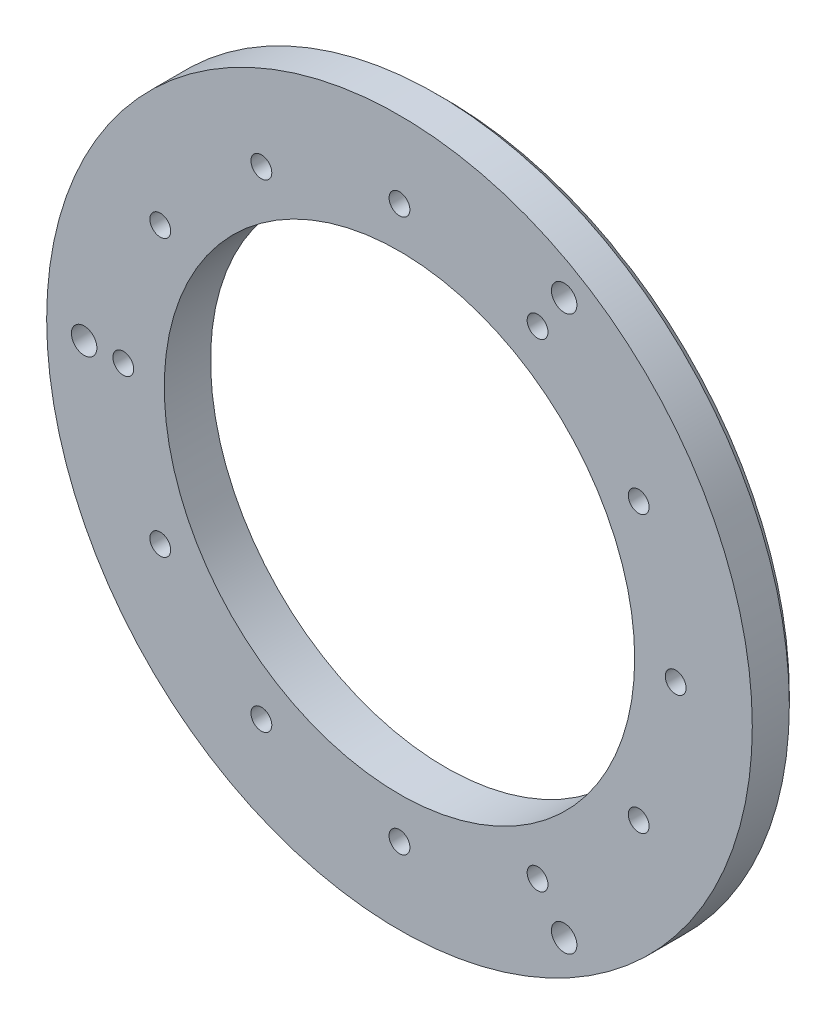
ISO-10303-21;
HEADER;
FILE_DESCRIPTION(('STEP AP214'),'2;1');
FILE_NAME('part.step','',(''),(''),'','','');
FILE_SCHEMA(('AUTOMOTIVE_DESIGN { 1 0 10303 214 1 1 1 1 }'));
ENDSEC;
DATA;
#1=APPLICATION_CONTEXT('core data for automotive mechanical design processes');
#2=APPLICATION_PROTOCOL_DEFINITION('international standard','automotive_design',2000,#1);
#3=PRODUCT_CONTEXT('',#1,'mechanical');
#4=PRODUCT('Part','Part','',(#3));
#5=PRODUCT_RELATED_PRODUCT_CATEGORY('part','',(#4));
#6=PRODUCT_DEFINITION_FORMATION('','',#4);
#7=PRODUCT_DEFINITION_CONTEXT('part definition',#1,'design');
#8=PRODUCT_DEFINITION('design','',#6,#7);
#9=PRODUCT_DEFINITION_SHAPE('','',#8);
#10=(LENGTH_UNIT() NAMED_UNIT(*) SI_UNIT(.MILLI.,.METRE.));
#11=(NAMED_UNIT(*) PLANE_ANGLE_UNIT() SI_UNIT($,.RADIAN.));
#12=(NAMED_UNIT(*) SI_UNIT($,.STERADIAN.) SOLID_ANGLE_UNIT());
#13=UNCERTAINTY_MEASURE_WITH_UNIT(LENGTH_MEASURE(1.E-05),#10,'distance_accuracy_value','');
#14=(GEOMETRIC_REPRESENTATION_CONTEXT(3) GLOBAL_UNCERTAINTY_ASSIGNED_CONTEXT((#13)) GLOBAL_UNIT_ASSIGNED_CONTEXT((#10,
#11,#12)) REPRESENTATION_CONTEXT('',''));
#15=CARTESIAN_POINT('',(0.,0.,0.));
#16=DIRECTION('',(0.,0.,1.));
#17=DIRECTION('',(1.,0.,0.));
#18=AXIS2_PLACEMENT_3D('',#15,#16,#17);
#19=CARTESIAN_POINT('',(0.,0.,0.));
#20=DIRECTION('',(0.,0.,1.));
#21=DIRECTION('',(1.,0.,0.));
#22=AXIS2_PLACEMENT_3D('',#19,#20,#21);
#23=PLANE('',#22);
#24=CARTESIAN_POINT('',(-68.1,0.,0.));
#25=DIRECTION('',(0.,0.,-1.));
#26=DIRECTION('',(-1.,0.,0.));
#27=AXIS2_PLACEMENT_3D('',#24,#25,#26);
#28=CIRCLE('',#27,5.2);
#29=CARTESIAN_POINT('',(-73.3,0.,0.));
#30=VERTEX_POINT('',#29);
#31=EDGE_CURVE('E261',#30,#30,#28,.T.);
#32=ORIENTED_EDGE('',*,*,#31,.F.);
#33=EDGE_LOOP('',(#32));
#34=FACE_BOUND('',#33,.T.);
#35=CARTESIAN_POINT('',(0.,0.,0.));
#36=DIRECTION('',(0.,0.,1.));
#37=DIRECTION('',(1.,0.,0.));
#38=AXIS2_PLACEMENT_3D('',#35,#36,#37);
#39=CIRCLE('',#38,50.8);
#40=CARTESIAN_POINT('',(50.8,0.,0.));
#41=VERTEX_POINT('',#40);
#42=EDGE_CURVE('E166',#41,#41,#39,.T.);
#43=ORIENTED_EDGE('',*,*,#42,.T.);
#44=EDGE_LOOP('',(#43));
#45=FACE_BOUND('',#44,.T.);
#46=CARTESIAN_POINT('',(29.8250000000003,51.6584153357416,0.));
#47=DIRECTION('',(0.,0.,-1.));
#48=DIRECTION('',(-1.,0.,0.));
#49=AXIS2_PLACEMENT_3D('',#46,#47,#48);
#50=CIRCLE('',#49,2.2479);
#51=CARTESIAN_POINT('',(27.5771000000003,51.6584153357416,0.));
#52=VERTEX_POINT('',#51);
#53=EDGE_CURVE('E174',#52,#52,#50,.T.);
#54=ORIENTED_EDGE('',*,*,#53,.F.);
#55=EDGE_LOOP('',(#54));
#56=FACE_BOUND('',#55,.T.);
#57=CARTESIAN_POINT('',(51.658415335742,29.8249999999996,0.));
#58=DIRECTION('',(0.,0.,-1.));
#59=DIRECTION('',(-1.,0.,0.));
#60=AXIS2_PLACEMENT_3D('',#57,#58,#59);
#61=CIRCLE('',#60,2.2479);
#62=CARTESIAN_POINT('',(49.410515335742,29.8249999999996,0.));
#63=VERTEX_POINT('',#62);
#64=EDGE_CURVE('E180',#63,#63,#61,.T.);
#65=ORIENTED_EDGE('',*,*,#64,.F.);
#66=EDGE_LOOP('',(#65));
#67=FACE_BOUND('',#66,.T.);
#68=CARTESIAN_POINT('',(59.65,-4.16333634234434E-13,0.));
#69=DIRECTION('',(0.,0.,-1.));
#70=DIRECTION('',(-1.,0.,0.));
#71=AXIS2_PLACEMENT_3D('',#68,#69,#70);
#72=CIRCLE('',#71,2.2479);
#73=CARTESIAN_POINT('',(57.4021,-4.16333634234434E-13,0.));
#74=VERTEX_POINT('',#73);
#75=EDGE_CURVE('E186',#74,#74,#72,.T.);
#76=ORIENTED_EDGE('',*,*,#75,.F.);
#77=EDGE_LOOP('',(#76));
#78=FACE_BOUND('',#77,.T.);
#79=CARTESIAN_POINT('',(51.6584153357416,-29.8250000000004,0.));
#80=DIRECTION('',(0.,0.,-1.));
#81=DIRECTION('',(-1.,0.,0.));
#82=AXIS2_PLACEMENT_3D('',#79,#80,#81);
#83=CIRCLE('',#82,2.2479);
#84=CARTESIAN_POINT('',(49.4105153357416,-29.8250000000004,0.));
#85=VERTEX_POINT('',#84);
#86=EDGE_CURVE('E192',#85,#85,#83,.T.);
#87=ORIENTED_EDGE('',*,*,#86,.F.);
#88=EDGE_LOOP('',(#87));
#89=FACE_BOUND('',#88,.T.);
#90=CARTESIAN_POINT('',(29.8249999999997,-51.658415335742,0.));
#91=DIRECTION('',(0.,0.,-1.));
#92=DIRECTION('',(-1.,0.,0.));
#93=AXIS2_PLACEMENT_3D('',#90,#91,#92);
#94=CIRCLE('',#93,2.2479);
#95=CARTESIAN_POINT('',(27.5770999999997,-51.658415335742,0.));
#96=VERTEX_POINT('',#95);
#97=EDGE_CURVE('E198',#96,#96,#94,.T.);
#98=ORIENTED_EDGE('',*,*,#97,.F.);
#99=EDGE_LOOP('',(#98));
#100=FACE_BOUND('',#99,.T.);
#101=CARTESIAN_POINT('',(-3.7470027081099E-13,-59.6500000000001,0.));
#102=DIRECTION('',(0.,0.,-1.));
#103=DIRECTION('',(-1.,0.,0.));
#104=AXIS2_PLACEMENT_3D('',#101,#102,#103);
#105=CIRCLE('',#104,2.2479);
#106=CARTESIAN_POINT('',(-2.24790000000037,-59.6500000000001,0.));
#107=VERTEX_POINT('',#106);
#108=EDGE_CURVE('E204',#107,#107,#105,.T.);
#109=ORIENTED_EDGE('',*,*,#108,.F.);
#110=EDGE_LOOP('',(#109));
#111=FACE_BOUND('',#110,.T.);
#112=CARTESIAN_POINT('',(-29.8250000000004,-51.6584153357416,0.));
#113=DIRECTION('',(0.,0.,-1.));
#114=DIRECTION('',(-1.,0.,0.));
#115=AXIS2_PLACEMENT_3D('',#112,#113,#114);
#116=CIRCLE('',#115,2.2479);
#117=CARTESIAN_POINT('',(-32.0729000000003,-51.6584153357416,0.));
#118=VERTEX_POINT('',#117);
#119=EDGE_CURVE('E210',#118,#118,#116,.T.);
#120=ORIENTED_EDGE('',*,*,#119,.F.);
#121=EDGE_LOOP('',(#120));
#122=FACE_BOUND('',#121,.T.);
#123=CARTESIAN_POINT('',(-51.658415335742,-29.8249999999997,0.));
#124=DIRECTION('',(0.,0.,-1.));
#125=DIRECTION('',(-1.,0.,0.));
#126=AXIS2_PLACEMENT_3D('',#123,#124,#125);
#127=CIRCLE('',#126,2.2479);
#128=CARTESIAN_POINT('',(-53.906315335742,-29.8249999999997,0.));
#129=VERTEX_POINT('',#128);
#130=EDGE_CURVE('E216',#129,#129,#127,.T.);
#131=ORIENTED_EDGE('',*,*,#130,.F.);
#132=EDGE_LOOP('',(#131));
#133=FACE_BOUND('',#132,.T.);
#134=CARTESIAN_POINT('',(-59.65,3.33066907387547E-13,0.));
#135=DIRECTION('',(0.,0.,-1.));
#136=DIRECTION('',(-1.,0.,0.));
#137=AXIS2_PLACEMENT_3D('',#134,#135,#136);
#138=CIRCLE('',#137,2.2479);
#139=CARTESIAN_POINT('',(-61.8979,3.33066907387547E-13,0.));
#140=VERTEX_POINT('',#139);
#141=EDGE_CURVE('E222',#140,#140,#138,.T.);
#142=ORIENTED_EDGE('',*,*,#141,.F.);
#143=EDGE_LOOP('',(#142));
#144=FACE_BOUND('',#143,.T.);
#145=CARTESIAN_POINT('',(-29.8249999999997,51.6584153357419,0.));
#146=DIRECTION('',(0.,0.,-1.));
#147=DIRECTION('',(-1.,0.,0.));
#148=AXIS2_PLACEMENT_3D('',#145,#146,#147);
#149=CIRCLE('',#148,2.2479);
#150=CARTESIAN_POINT('',(-32.0728999999997,51.6584153357419,0.));
#151=VERTEX_POINT('',#150);
#152=EDGE_CURVE('E228',#151,#151,#149,.T.);
#153=ORIENTED_EDGE('',*,*,#152,.F.);
#154=EDGE_LOOP('',(#153));
#155=FACE_BOUND('',#154,.T.);
#156=CARTESIAN_POINT('',(-51.6584153357416,29.8250000000003,0.));
#157=DIRECTION('',(0.,0.,-1.));
#158=DIRECTION('',(-1.,0.,0.));
#159=AXIS2_PLACEMENT_3D('',#156,#157,#158);
#160=CIRCLE('',#159,2.2479);
#161=CARTESIAN_POINT('',(-53.9063153357416,29.8250000000003,0.));
#162=VERTEX_POINT('',#161);
#163=EDGE_CURVE('E234',#162,#162,#160,.T.);
#164=ORIENTED_EDGE('',*,*,#163,.F.);
#165=EDGE_LOOP('',(#164));
#166=FACE_BOUND('',#165,.T.);
#167=CARTESIAN_POINT('',(3.6949610038306E-13,59.65,0.));
#168=DIRECTION('',(0.,0.,-1.));
#169=DIRECTION('',(-1.,0.,0.));
#170=AXIS2_PLACEMENT_3D('',#167,#168,#169);
#171=CIRCLE('',#170,2.2479);
#172=CARTESIAN_POINT('',(-2.24789999999963,59.65,0.));
#173=VERTEX_POINT('',#172);
#174=EDGE_CURVE('E240',#173,#173,#171,.T.);
#175=ORIENTED_EDGE('',*,*,#174,.F.);
#176=EDGE_LOOP('',(#175));
#177=FACE_BOUND('',#176,.T.);
#178=CARTESIAN_POINT('',(0.,0.,0.));
#179=DIRECTION('',(0.,0.,1.));
#180=DIRECTION('',(1.,0.,0.));
#181=AXIS2_PLACEMENT_3D('',#178,#179,#180);
#182=CIRCLE('',#181,74.2);
#183=CARTESIAN_POINT('',(40.0680427160487,62.4515168182879,0.));
#184=VERTEX_POINT('',#183);
#185=CARTESIAN_POINT('',(40.0680427160498,-62.4515168182872,0.));
#186=VERTEX_POINT('',#185);
#187=EDGE_CURVE('E69',#184,#186,#182,.F.);
#188=ORIENTED_EDGE('',*,*,#187,.T.);
#189=CARTESIAN_POINT('',(35.5650000000003,-59.8510156555431,0.));
#190=DIRECTION('',(0.,0.,-1.));
#191=DIRECTION('',(-1.,0.,0.));
#192=AXIS2_PLACEMENT_3D('',#189,#190,#191);
#193=CIRCLE('',#192,5.2);
#194=CARTESIAN_POINT('',(35.6962298958078,-65.0493594989654,0.));
#195=VERTEX_POINT('',#194);
#196=EDGE_CURVE('E51',#195,#186,#193,.T.);
#197=ORIENTED_EDGE('',*,*,#196,.F.);
#198=CARTESIAN_POINT('',(35.69622989581,65.0493594989642,0.));
#199=VERTEX_POINT('',#198);
#200=EDGE_CURVE('E58',#195,#199,#182,.F.);
#201=ORIENTED_EDGE('',*,*,#200,.T.);
#202=CARTESIAN_POINT('',(35.5650000000002,59.851015655542,0.));
#203=DIRECTION('',(0.,0.,-1.));
#204=DIRECTION('',(-1.,0.,0.));
#205=AXIS2_PLACEMENT_3D('',#202,#203,#204);
#206=CIRCLE('',#205,5.2);
#207=EDGE_CURVE('E249',#184,#199,#206,.T.);
#208=ORIENTED_EDGE('',*,*,#207,.F.);
#209=EDGE_LOOP('',(#188,#197,#201,#208));
#210=FACE_BOUND('',#209,.T.);
#211=ADVANCED_FACE('F33',(#34,#45,#56,#67,#78,#89,#100,#111,#122,#133,#144,#155,#166,#177,#210),
#23,.F.);
#212=CARTESIAN_POINT('',(0.,0.,10.));
#213=DIRECTION('',(0.,0.,1.));
#214=DIRECTION('',(1.,0.,0.));
#215=AXIS2_PLACEMENT_3D('',#212,#213,#214);
#216=PLANE('',#215);
#217=CARTESIAN_POINT('',(-68.1,0.,10.));
#218=DIRECTION('',(0.,0.,-1.));
#219=DIRECTION('',(-1.,0.,0.));
#220=AXIS2_PLACEMENT_3D('',#217,#218,#219);
#221=CIRCLE('',#220,2.74999999999999);
#222=CARTESIAN_POINT('',(-70.85,0.,10.));
#223=VERTEX_POINT('',#222);
#224=EDGE_CURVE('E71',#223,#223,#221,.T.);
#225=ORIENTED_EDGE('',*,*,#224,.T.);
#226=EDGE_LOOP('',(#225));
#227=FACE_BOUND('',#226,.T.);
#228=CARTESIAN_POINT('',(35.5650000000003,-59.8510156555431,10.));
#229=DIRECTION('',(0.,0.,-1.));
#230=DIRECTION('',(-1.,0.,0.));
#231=AXIS2_PLACEMENT_3D('',#228,#229,#230);
#232=CIRCLE('',#231,2.75);
#233=CARTESIAN_POINT('',(32.8150000000003,-59.8510156555431,10.));
#234=VERTEX_POINT('',#233);
#235=EDGE_CURVE('E251',#234,#234,#232,.T.);
#236=ORIENTED_EDGE('',*,*,#235,.T.);
#237=EDGE_LOOP('',(#236));
#238=FACE_BOUND('',#237,.T.);
#239=CARTESIAN_POINT('',(35.5650000000002,59.851015655542,10.));
#240=DIRECTION('',(0.,0.,-1.));
#241=DIRECTION('',(-1.,0.,0.));
#242=AXIS2_PLACEMENT_3D('',#239,#240,#241);
#243=CIRCLE('',#242,2.75);
#244=CARTESIAN_POINT('',(32.8150000000003,59.851015655542,10.));
#245=VERTEX_POINT('',#244);
#246=EDGE_CURVE('E243',#245,#245,#243,.T.);
#247=ORIENTED_EDGE('',*,*,#246,.T.);
#248=EDGE_LOOP('',(#247));
#249=FACE_BOUND('',#248,.T.);
#250=CARTESIAN_POINT('',(3.6949610038306E-13,59.65,10.));
#251=DIRECTION('',(0.,0.,-1.));
#252=DIRECTION('',(-1.,0.,0.));
#253=AXIS2_PLACEMENT_3D('',#250,#251,#252);
#254=CIRCLE('',#253,2.2479);
#255=CARTESIAN_POINT('',(-2.24789999999963,59.65,10.));
#256=VERTEX_POINT('',#255);
#257=EDGE_CURVE('E237',#256,#256,#254,.T.);
#258=ORIENTED_EDGE('',*,*,#257,.T.);
#259=EDGE_LOOP('',(#258));
#260=FACE_BOUND('',#259,.T.);
#261=CARTESIAN_POINT('',(-51.6584153357416,29.8250000000003,10.));
#262=DIRECTION('',(0.,0.,-1.));
#263=DIRECTION('',(-1.,0.,0.));
#264=AXIS2_PLACEMENT_3D('',#261,#262,#263);
#265=CIRCLE('',#264,2.2479);
#266=CARTESIAN_POINT('',(-53.9063153357416,29.8250000000003,10.));
#267=VERTEX_POINT('',#266);
#268=EDGE_CURVE('E231',#267,#267,#265,.T.);
#269=ORIENTED_EDGE('',*,*,#268,.T.);
#270=EDGE_LOOP('',(#269));
#271=FACE_BOUND('',#270,.T.);
#272=CARTESIAN_POINT('',(-29.8249999999997,51.6584153357419,10.));
#273=DIRECTION('',(0.,0.,-1.));
#274=DIRECTION('',(-1.,0.,0.));
#275=AXIS2_PLACEMENT_3D('',#272,#273,#274);
#276=CIRCLE('',#275,2.2479);
#277=CARTESIAN_POINT('',(-32.0728999999997,51.6584153357419,10.));
#278=VERTEX_POINT('',#277);
#279=EDGE_CURVE('E225',#278,#278,#276,.T.);
#280=ORIENTED_EDGE('',*,*,#279,.T.);
#281=EDGE_LOOP('',(#280));
#282=FACE_BOUND('',#281,.T.);
#283=CARTESIAN_POINT('',(-59.65,3.33066907387547E-13,10.));
#284=DIRECTION('',(0.,0.,-1.));
#285=DIRECTION('',(-1.,0.,0.));
#286=AXIS2_PLACEMENT_3D('',#283,#284,#285);
#287=CIRCLE('',#286,2.2479);
#288=CARTESIAN_POINT('',(-61.8979,3.33066907387547E-13,10.));
#289=VERTEX_POINT('',#288);
#290=EDGE_CURVE('E219',#289,#289,#287,.T.);
#291=ORIENTED_EDGE('',*,*,#290,.T.);
#292=EDGE_LOOP('',(#291));
#293=FACE_BOUND('',#292,.T.);
#294=CARTESIAN_POINT('',(-51.658415335742,-29.8249999999997,10.));
#295=DIRECTION('',(0.,0.,-1.));
#296=DIRECTION('',(-1.,0.,0.));
#297=AXIS2_PLACEMENT_3D('',#294,#295,#296);
#298=CIRCLE('',#297,2.2479);
#299=CARTESIAN_POINT('',(-53.906315335742,-29.8249999999997,10.));
#300=VERTEX_POINT('',#299);
#301=EDGE_CURVE('E213',#300,#300,#298,.T.);
#302=ORIENTED_EDGE('',*,*,#301,.T.);
#303=EDGE_LOOP('',(#302));
#304=FACE_BOUND('',#303,.T.);
#305=CARTESIAN_POINT('',(-29.8250000000004,-51.6584153357416,10.));
#306=DIRECTION('',(0.,0.,-1.));
#307=DIRECTION('',(-1.,0.,0.));
#308=AXIS2_PLACEMENT_3D('',#305,#306,#307);
#309=CIRCLE('',#308,2.2479);
#310=CARTESIAN_POINT('',(-32.0729000000003,-51.6584153357416,10.));
#311=VERTEX_POINT('',#310);
#312=EDGE_CURVE('E207',#311,#311,#309,.T.);
#313=ORIENTED_EDGE('',*,*,#312,.T.);
#314=EDGE_LOOP('',(#313));
#315=FACE_BOUND('',#314,.T.);
#316=CARTESIAN_POINT('',(-3.7470027081099E-13,-59.6500000000001,10.));
#317=DIRECTION('',(0.,0.,-1.));
#318=DIRECTION('',(-1.,0.,0.));
#319=AXIS2_PLACEMENT_3D('',#316,#317,#318);
#320=CIRCLE('',#319,2.2479);
#321=CARTESIAN_POINT('',(-2.24790000000037,-59.6500000000001,10.));
#322=VERTEX_POINT('',#321);
#323=EDGE_CURVE('E201',#322,#322,#320,.T.);
#324=ORIENTED_EDGE('',*,*,#323,.T.);
#325=EDGE_LOOP('',(#324));
#326=FACE_BOUND('',#325,.T.);
#327=CARTESIAN_POINT('',(29.8249999999997,-51.658415335742,10.));
#328=DIRECTION('',(0.,0.,-1.));
#329=DIRECTION('',(-1.,0.,0.));
#330=AXIS2_PLACEMENT_3D('',#327,#328,#329);
#331=CIRCLE('',#330,2.2479);
#332=CARTESIAN_POINT('',(27.5770999999997,-51.658415335742,10.));
#333=VERTEX_POINT('',#332);
#334=EDGE_CURVE('E195',#333,#333,#331,.T.);
#335=ORIENTED_EDGE('',*,*,#334,.T.);
#336=EDGE_LOOP('',(#335));
#337=FACE_BOUND('',#336,.T.);
#338=CARTESIAN_POINT('',(51.6584153357416,-29.8250000000004,10.));
#339=DIRECTION('',(0.,0.,-1.));
#340=DIRECTION('',(-1.,0.,0.));
#341=AXIS2_PLACEMENT_3D('',#338,#339,#340);
#342=CIRCLE('',#341,2.2479);
#343=CARTESIAN_POINT('',(49.4105153357416,-29.8250000000004,10.));
#344=VERTEX_POINT('',#343);
#345=EDGE_CURVE('E189',#344,#344,#342,.T.);
#346=ORIENTED_EDGE('',*,*,#345,.T.);
#347=EDGE_LOOP('',(#346));
#348=FACE_BOUND('',#347,.T.);
#349=CARTESIAN_POINT('',(59.65,-4.16333634234434E-13,10.));
#350=DIRECTION('',(0.,0.,-1.));
#351=DIRECTION('',(-1.,0.,0.));
#352=AXIS2_PLACEMENT_3D('',#349,#350,#351);
#353=CIRCLE('',#352,2.2479);
#354=CARTESIAN_POINT('',(57.4021,-4.16333634234434E-13,10.));
#355=VERTEX_POINT('',#354);
#356=EDGE_CURVE('E183',#355,#355,#353,.T.);
#357=ORIENTED_EDGE('',*,*,#356,.T.);
#358=EDGE_LOOP('',(#357));
#359=FACE_BOUND('',#358,.T.);
#360=CARTESIAN_POINT('',(51.658415335742,29.8249999999996,10.));
#361=DIRECTION('',(0.,0.,-1.));
#362=DIRECTION('',(-1.,0.,0.));
#363=AXIS2_PLACEMENT_3D('',#360,#361,#362);
#364=CIRCLE('',#363,2.2479);
#365=CARTESIAN_POINT('',(49.410515335742,29.8249999999996,10.));
#366=VERTEX_POINT('',#365);
#367=EDGE_CURVE('E177',#366,#366,#364,.T.);
#368=ORIENTED_EDGE('',*,*,#367,.T.);
#369=EDGE_LOOP('',(#368));
#370=FACE_BOUND('',#369,.T.);
#371=CARTESIAN_POINT('',(29.8250000000003,51.6584153357416,10.));
#372=DIRECTION('',(0.,0.,-1.));
#373=DIRECTION('',(-1.,0.,0.));
#374=AXIS2_PLACEMENT_3D('',#371,#372,#373);
#375=CIRCLE('',#374,2.2479);
#376=CARTESIAN_POINT('',(27.5771000000003,51.6584153357416,10.));
#377=VERTEX_POINT('',#376);
#378=EDGE_CURVE('E170',#377,#377,#375,.T.);
#379=ORIENTED_EDGE('',*,*,#378,.T.);
#380=EDGE_LOOP('',(#379));
#381=FACE_BOUND('',#380,.T.);
#382=CARTESIAN_POINT('',(0.,0.,10.));
#383=DIRECTION('',(0.,0.,1.));
#384=DIRECTION('',(1.,0.,0.));
#385=AXIS2_PLACEMENT_3D('',#382,#383,#384);
#386=CIRCLE('',#385,76.2);
#387=CARTESIAN_POINT('',(76.2,0.,10.));
#388=VERTEX_POINT('',#387);
#389=EDGE_CURVE('E78',#388,#388,#386,.T.);
#390=ORIENTED_EDGE('',*,*,#389,.T.);
#391=EDGE_LOOP('',(#390));
#392=FACE_BOUND('',#391,.T.);
#393=CARTESIAN_POINT('',(0.,0.,10.));
#394=DIRECTION('',(0.,0.,1.));
#395=DIRECTION('',(1.,0.,0.));
#396=AXIS2_PLACEMENT_3D('',#393,#394,#395);
#397=CIRCLE('',#396,50.8);
#398=CARTESIAN_POINT('',(50.8,0.,10.));
#399=VERTEX_POINT('',#398);
#400=EDGE_CURVE('E164',#399,#399,#397,.T.);
#401=ORIENTED_EDGE('',*,*,#400,.F.);
#402=EDGE_LOOP('',(#401));
#403=FACE_BOUND('',#402,.T.);
#404=ADVANCED_FACE('F149',(#227,#238,#249,#260,#271,#282,#293,#304,#315,#326,#337,#348,#359,
#370,#381,#392,#403),#216,.T.);
#405=CARTESIAN_POINT('',(0.,0.,10.));
#406=DIRECTION('',(0.,0.,-1.));
#407=DIRECTION('',(-1.,0.,0.));
#408=AXIS2_PLACEMENT_3D('',#405,#406,#407);
#409=CYLINDRICAL_SURFACE('',#408,76.2);
#410=CARTESIAN_POINT('',(0.,0.,1.99999999999997));
#411=DIRECTION('',(0.,0.,1.));
#412=DIRECTION('',(1.,0.,0.));
#413=AXIS2_PLACEMENT_3D('',#410,#411,#412);
#414=CIRCLE('',#413,76.2);
#415=CARTESIAN_POINT('',(76.2,0.,1.99999999999997));
#416=VERTEX_POINT('',#415);
#417=EDGE_CURVE('E75',#416,#416,#414,.T.);
#418=ORIENTED_EDGE('',*,*,#417,.T.);
#419=EDGE_LOOP('',(#418));
#420=FACE_BOUND('',#419,.T.);
#421=ORIENTED_EDGE('',*,*,#389,.F.);
#422=EDGE_LOOP('',(#421));
#423=FACE_BOUND('',#422,.T.);
#424=ADVANCED_FACE('F147',(#420,#423),#409,.T.);
#425=CARTESIAN_POINT('',(0.,0.,10.));
#426=DIRECTION('',(0.,0.,-1.));
#427=DIRECTION('',(-1.,0.,0.));
#428=AXIS2_PLACEMENT_3D('',#425,#426,#427);
#429=CYLINDRICAL_SURFACE('',#428,50.8);
#430=ORIENTED_EDGE('',*,*,#400,.T.);
#431=EDGE_LOOP('',(#430));
#432=FACE_BOUND('',#431,.T.);
#433=ORIENTED_EDGE('',*,*,#42,.F.);
#434=EDGE_LOOP('',(#433));
#435=FACE_BOUND('',#434,.T.);
#436=ADVANCED_FACE('F144',(#432,#435),#429,.F.);
#437=CARTESIAN_POINT('',(0.,0.,1.99999999999997));
#438=DIRECTION('',(0.,0.,1.));
#439=DIRECTION('',(1.,0.,0.));
#440=AXIS2_PLACEMENT_3D('',#437,#438,#439);
#441=CONICAL_SURFACE('',#440,76.2,0.785398163397452);
#442=CARTESIAN_POINT('',(40.0686274968654,-62.4509040011227,-0.00020000000000384));
#443=CARTESIAN_POINT('',(39.9961182226043,-62.5268968193415,0.0246042193821913));
#444=CARTESIAN_POINT('',(39.9222004535592,-62.6019667011707,0.0480818417350176));
#445=CARTESIAN_POINT('',(39.7715485955164,-62.7500934031113,0.0922581669072097));
#446=CARTESIAN_POINT('',(39.6948140775887,-62.8231499136395,0.112956444238428));
#447=CARTESIAN_POINT('',(39.4603354234034,-63.0390922317069,0.170703720281933));
#448=CARTESIAN_POINT('',(39.2983950134978,-63.178667847733,0.20337792319823));
#449=CARTESIAN_POINT('',(38.9694109865664,-63.443030598132,0.255293064284077));
#450=CARTESIAN_POINT('',(38.802693863853,-63.5681470349653,0.274928471689609));
#451=CARTESIAN_POINT('',(38.4605452176928,-63.8071641850731,0.30184160255526));
#452=CARTESIAN_POINT('',(38.285117653942,-63.9210699256679,0.309124889199417));
#453=CARTESIAN_POINT('',(37.9198929857638,-64.1408061073979,0.311167941207557));
#454=CARTESIAN_POINT('',(37.7298025637932,-64.2461544407139,0.305432914618143));
#455=CARTESIAN_POINT('',(37.3432698882085,-64.4428852038758,0.280590362713572));
#456=CARTESIAN_POINT('',(37.1468242680415,-64.5342600797519,0.261475635330209));
#457=CARTESIAN_POINT('',(36.7427043230878,-64.7055441546688,0.209573872058972));
#458=CARTESIAN_POINT('',(36.5348756133263,-64.7849554318819,0.176342354695751));
#459=CARTESIAN_POINT('',(36.2211986111545,-64.8926428211566,0.117013350271043));
#460=CARTESIAN_POINT('',(36.1163487806262,-64.9266252813665,0.0956644906107937));
#461=CARTESIAN_POINT('',(35.90618616652,-64.9908698275599,0.0499550193184994));
#462=CARTESIAN_POINT('',(35.8008734656194,-65.0211325520516,0.0255949260212202));
#463=CARTESIAN_POINT('',(35.6954120757307,-65.0495801430246,-0.000200000000002114));
#464=B_SPLINE_CURVE_WITH_KNOTS('',3,(#442,#443,#444,#445,#446,#447,#448,#449,#450,#451,#452,
#453,#454,#455,#456,#457,#458,#459,#460,#461,#462,#463),.UNSPECIFIED.,.F.,.F.,(4,2,2,2,2,2,2,2,
2,2,4),(0.,0.323732475944112,0.647514455519947,1.29543024397715,1.92272331506588,
2.54973378897744,3.20097236841888,3.85256176849639,4.52639578973986,4.86311243103485,
5.19977119255143),.UNSPECIFIED.);
#465=EDGE_CURVE('E11',#186,#195,#464,.T.);
#466=ORIENTED_EDGE('',*,*,#465,.F.);
#467=ORIENTED_EDGE('',*,*,#187,.F.);
#468=CARTESIAN_POINT('',(35.6954120757329,65.0495801430234,-0.000200000000002197));
#469=CARTESIAN_POINT('',(35.7968231347556,65.0222250633746,0.0246042193821765));
#470=CARTESIAN_POINT('',(35.8980969427024,64.9931916419019,0.0480818417349833));
#471=CARTESIAN_POINT('',(36.1002228918198,64.9316887732456,0.0922581669071317));
#472=CARTESIAN_POINT('',(36.2010749661431,64.8992188013202,0.112956444238326));
#473=CARTESIAN_POINT('',(36.5028405332267,64.7965111262246,0.170703720281761));
#474=CARTESIAN_POINT('',(36.702852803578,64.7210052280551,0.203377923198012));
#475=CARTESIAN_POINT('',(37.0923281611055,64.558441087934,0.255293064283777));
#476=CARTESIAN_POINT('',(37.2819243880607,64.4718270446382,0.274928471689271));
#477=CARTESIAN_POINT('',(37.655432114955,64.2855829250931,0.301841602554849));
#478=CARTESIAN_POINT('',(37.8393461373997,64.1859587301794,0.30912488919897));
#479=CARTESIAN_POINT('',(38.2069513622279,63.9702286986912,0.311167941207033));
#480=CARTESIAN_POINT('',(38.3903593523981,63.8536347494529,0.305432914617594));
#481=CARTESIAN_POINT('',(38.7479455782317,63.6081910826728,0.28059036271302));
#482=CARTESIAN_POINT('',(38.9221187886247,63.4793347968134,0.261475635329679));
#483=CARTESIAN_POINT('',(39.2657629908161,63.2062783438057,0.209573872058527));
#484=CARTESIAN_POINT('',(39.4348704594215,63.0617045300929,0.176342354695372));
#485=CARTESIAN_POINT('',(39.6794175245644,62.8376809410895,0.117013350270786));
#486=CARTESIAN_POINT('',(39.7593917425326,62.7618362377538,0.0956644906105804));
#487=CARTESIAN_POINT('',(39.9162938493191,62.6079615648236,0.049955019318385));
#488=CARTESIAN_POINT('',(39.9932222594219,62.5299319731057,0.0255949260211609));
#489=CARTESIAN_POINT('',(40.0686274968643,62.4509040011234,-0.000199999999999437));
#490=B_SPLINE_CURVE_WITH_KNOTS('',3,(#468,#469,#470,#471,#472,#473,#474,#475,#476,#477,#478,
#479,#480,#481,#482,#483,#484,#485,#486,#487,#488,#489),.UNSPECIFIED.,.F.,.F.,(4,2,2,2,2,2,2,2,
2,2,4),(0.,0.323732475944102,0.647514455519897,1.29543024397702,1.92272331506571,
2.54973378897721,3.20097236841773,3.85256176849433,4.52639578973679,4.86311243103127,
5.19977119254735),.UNSPECIFIED.);
#491=EDGE_CURVE('E46',#199,#184,#490,.T.);
#492=ORIENTED_EDGE('',*,*,#491,.F.);
#493=ORIENTED_EDGE('',*,*,#200,.F.);
#494=EDGE_LOOP('',(#466,#467,#492,#493));
#495=FACE_BOUND('',#494,.T.);
#496=ORIENTED_EDGE('',*,*,#417,.F.);
#497=EDGE_LOOP('',(#496));
#498=FACE_BOUND('',#497,.T.);
#499=ADVANCED_FACE('F35',(#495,#498),#441,.T.);
#500=CARTESIAN_POINT('',(29.8250000000003,51.6584153357416,0.));
#501=DIRECTION('',(0.,0.,-1.));
#502=DIRECTION('',(-1.,0.,0.));
#503=AXIS2_PLACEMENT_3D('',#500,#501,#502);
#504=CYLINDRICAL_SURFACE('',#503,2.2479);
#505=ORIENTED_EDGE('',*,*,#378,.F.);
#506=EDGE_LOOP('',(#505));
#507=FACE_BOUND('',#506,.T.);
#508=ORIENTED_EDGE('',*,*,#53,.T.);
#509=EDGE_LOOP('',(#508));
#510=FACE_BOUND('',#509,.T.);
#511=ADVANCED_FACE('F139',(#507,#510),#504,.F.);
#512=CARTESIAN_POINT('',(51.658415335742,29.8249999999996,0.));
#513=DIRECTION('',(0.,0.,-1.));
#514=DIRECTION('',(-1.,0.,0.));
#515=AXIS2_PLACEMENT_3D('',#512,#513,#514);
#516=CYLINDRICAL_SURFACE('',#515,2.2479);
#517=ORIENTED_EDGE('',*,*,#367,.F.);
#518=EDGE_LOOP('',(#517));
#519=FACE_BOUND('',#518,.T.);
#520=ORIENTED_EDGE('',*,*,#64,.T.);
#521=EDGE_LOOP('',(#520));
#522=FACE_BOUND('',#521,.T.);
#523=ADVANCED_FACE('F135',(#519,#522),#516,.F.);
#524=CARTESIAN_POINT('',(59.65,-4.16333634234434E-13,0.));
#525=DIRECTION('',(0.,0.,-1.));
#526=DIRECTION('',(-1.,0.,0.));
#527=AXIS2_PLACEMENT_3D('',#524,#525,#526);
#528=CYLINDRICAL_SURFACE('',#527,2.2479);
#529=ORIENTED_EDGE('',*,*,#356,.F.);
#530=EDGE_LOOP('',(#529));
#531=FACE_BOUND('',#530,.T.);
#532=ORIENTED_EDGE('',*,*,#75,.T.);
#533=EDGE_LOOP('',(#532));
#534=FACE_BOUND('',#533,.T.);
#535=ADVANCED_FACE('F131',(#531,#534),#528,.F.);
#536=CARTESIAN_POINT('',(51.6584153357416,-29.8250000000004,0.));
#537=DIRECTION('',(0.,0.,-1.));
#538=DIRECTION('',(-1.,0.,0.));
#539=AXIS2_PLACEMENT_3D('',#536,#537,#538);
#540=CYLINDRICAL_SURFACE('',#539,2.2479);
#541=ORIENTED_EDGE('',*,*,#345,.F.);
#542=EDGE_LOOP('',(#541));
#543=FACE_BOUND('',#542,.T.);
#544=ORIENTED_EDGE('',*,*,#86,.T.);
#545=EDGE_LOOP('',(#544));
#546=FACE_BOUND('',#545,.T.);
#547=ADVANCED_FACE('F127',(#543,#546),#540,.F.);
#548=CARTESIAN_POINT('',(29.8249999999997,-51.658415335742,0.));
#549=DIRECTION('',(0.,0.,-1.));
#550=DIRECTION('',(-1.,0.,0.));
#551=AXIS2_PLACEMENT_3D('',#548,#549,#550);
#552=CYLINDRICAL_SURFACE('',#551,2.2479);
#553=ORIENTED_EDGE('',*,*,#334,.F.);
#554=EDGE_LOOP('',(#553));
#555=FACE_BOUND('',#554,.T.);
#556=ORIENTED_EDGE('',*,*,#97,.T.);
#557=EDGE_LOOP('',(#556));
#558=FACE_BOUND('',#557,.T.);
#559=ADVANCED_FACE('F123',(#555,#558),#552,.F.);
#560=CARTESIAN_POINT('',(-3.7470027081099E-13,-59.6500000000001,0.));
#561=DIRECTION('',(0.,0.,-1.));
#562=DIRECTION('',(-1.,0.,0.));
#563=AXIS2_PLACEMENT_3D('',#560,#561,#562);
#564=CYLINDRICAL_SURFACE('',#563,2.2479);
#565=ORIENTED_EDGE('',*,*,#323,.F.);
#566=EDGE_LOOP('',(#565));
#567=FACE_BOUND('',#566,.T.);
#568=ORIENTED_EDGE('',*,*,#108,.T.);
#569=EDGE_LOOP('',(#568));
#570=FACE_BOUND('',#569,.T.);
#571=ADVANCED_FACE('F119',(#567,#570),#564,.F.);
#572=CARTESIAN_POINT('',(-29.8250000000004,-51.6584153357416,0.));
#573=DIRECTION('',(0.,0.,-1.));
#574=DIRECTION('',(-1.,0.,0.));
#575=AXIS2_PLACEMENT_3D('',#572,#573,#574);
#576=CYLINDRICAL_SURFACE('',#575,2.2479);
#577=ORIENTED_EDGE('',*,*,#312,.F.);
#578=EDGE_LOOP('',(#577));
#579=FACE_BOUND('',#578,.T.);
#580=ORIENTED_EDGE('',*,*,#119,.T.);
#581=EDGE_LOOP('',(#580));
#582=FACE_BOUND('',#581,.T.);
#583=ADVANCED_FACE('F115',(#579,#582),#576,.F.);
#584=CARTESIAN_POINT('',(-51.658415335742,-29.8249999999997,0.));
#585=DIRECTION('',(0.,0.,-1.));
#586=DIRECTION('',(-1.,0.,0.));
#587=AXIS2_PLACEMENT_3D('',#584,#585,#586);
#588=CYLINDRICAL_SURFACE('',#587,2.2479);
#589=ORIENTED_EDGE('',*,*,#301,.F.);
#590=EDGE_LOOP('',(#589));
#591=FACE_BOUND('',#590,.T.);
#592=ORIENTED_EDGE('',*,*,#130,.T.);
#593=EDGE_LOOP('',(#592));
#594=FACE_BOUND('',#593,.T.);
#595=ADVANCED_FACE('F111',(#591,#594),#588,.F.);
#596=CARTESIAN_POINT('',(-59.65,3.33066907387547E-13,0.));
#597=DIRECTION('',(0.,0.,-1.));
#598=DIRECTION('',(-1.,0.,0.));
#599=AXIS2_PLACEMENT_3D('',#596,#597,#598);
#600=CYLINDRICAL_SURFACE('',#599,2.2479);
#601=ORIENTED_EDGE('',*,*,#290,.F.);
#602=EDGE_LOOP('',(#601));
#603=FACE_BOUND('',#602,.T.);
#604=ORIENTED_EDGE('',*,*,#141,.T.);
#605=EDGE_LOOP('',(#604));
#606=FACE_BOUND('',#605,.T.);
#607=ADVANCED_FACE('F107',(#603,#606),#600,.F.);
#608=CARTESIAN_POINT('',(-29.8249999999997,51.6584153357419,0.));
#609=DIRECTION('',(0.,0.,-1.));
#610=DIRECTION('',(-1.,0.,0.));
#611=AXIS2_PLACEMENT_3D('',#608,#609,#610);
#612=CYLINDRICAL_SURFACE('',#611,2.2479);
#613=ORIENTED_EDGE('',*,*,#279,.F.);
#614=EDGE_LOOP('',(#613));
#615=FACE_BOUND('',#614,.T.);
#616=ORIENTED_EDGE('',*,*,#152,.T.);
#617=EDGE_LOOP('',(#616));
#618=FACE_BOUND('',#617,.T.);
#619=ADVANCED_FACE('F103',(#615,#618),#612,.F.);
#620=CARTESIAN_POINT('',(-51.6584153357416,29.8250000000003,0.));
#621=DIRECTION('',(0.,0.,-1.));
#622=DIRECTION('',(-1.,0.,0.));
#623=AXIS2_PLACEMENT_3D('',#620,#621,#622);
#624=CYLINDRICAL_SURFACE('',#623,2.2479);
#625=ORIENTED_EDGE('',*,*,#268,.F.);
#626=EDGE_LOOP('',(#625));
#627=FACE_BOUND('',#626,.T.);
#628=ORIENTED_EDGE('',*,*,#163,.T.);
#629=EDGE_LOOP('',(#628));
#630=FACE_BOUND('',#629,.T.);
#631=ADVANCED_FACE('F99',(#627,#630),#624,.F.);
#632=CARTESIAN_POINT('',(3.6949610038306E-13,59.65,0.));
#633=DIRECTION('',(0.,0.,-1.));
#634=DIRECTION('',(-1.,0.,0.));
#635=AXIS2_PLACEMENT_3D('',#632,#633,#634);
#636=CYLINDRICAL_SURFACE('',#635,2.2479);
#637=ORIENTED_EDGE('',*,*,#257,.F.);
#638=EDGE_LOOP('',(#637));
#639=FACE_BOUND('',#638,.T.);
#640=ORIENTED_EDGE('',*,*,#174,.T.);
#641=EDGE_LOOP('',(#640));
#642=FACE_BOUND('',#641,.T.);
#643=ADVANCED_FACE('F95',(#639,#642),#636,.F.);
#644=CARTESIAN_POINT('',(35.5650000000002,59.851015655542,0.));
#645=DIRECTION('',(0.,0.,-1.));
#646=DIRECTION('',(-1.,0.,0.));
#647=AXIS2_PLACEMENT_3D('',#644,#645,#646);
#648=CYLINDRICAL_SURFACE('',#647,2.74999999999999);
#649=ORIENTED_EDGE('',*,*,#246,.F.);
#650=EDGE_LOOP('',(#649));
#651=FACE_BOUND('',#650,.T.);
#652=CARTESIAN_POINT('',(35.5650000000002,59.851015655542,2.45000000000001));
#653=DIRECTION('',(0.,0.,-1.));
#654=DIRECTION('',(-1.,0.,0.));
#655=AXIS2_PLACEMENT_3D('',#652,#653,#654);
#656=CIRCLE('',#655,2.74999999999999);
#657=CARTESIAN_POINT('',(32.8150000000003,59.851015655542,2.45000000000001));
#658=VERTEX_POINT('',#657);
#659=EDGE_CURVE('E246',#658,#658,#656,.T.);
#660=ORIENTED_EDGE('',*,*,#659,.T.);
#661=EDGE_LOOP('',(#660));
#662=FACE_BOUND('',#661,.T.);
#663=ADVANCED_FACE('F91',(#651,#662),#648,.F.);
#664=CARTESIAN_POINT('',(35.5650000000002,59.851015655542,0.));
#665=DIRECTION('',(0.,0.,-1.));
#666=DIRECTION('',(-1.,0.,0.));
#667=AXIS2_PLACEMENT_3D('',#664,#665,#666);
#668=CONICAL_SURFACE('',#667,5.2,0.785398163397448);
#669=ORIENTED_EDGE('',*,*,#491,.T.);
#670=ORIENTED_EDGE('',*,*,#207,.T.);
#671=EDGE_LOOP('',(#669,#670));
#672=FACE_BOUND('',#671,.T.);
#673=ORIENTED_EDGE('',*,*,#659,.F.);
#674=EDGE_LOOP('',(#673));
#675=FACE_BOUND('',#674,.T.);
#676=ADVANCED_FACE('F85',(#672,#675),#668,.F.);
#677=CARTESIAN_POINT('',(35.5650000000003,-59.8510156555431,0.));
#678=DIRECTION('',(0.,0.,-1.));
#679=DIRECTION('',(-1.,0.,0.));
#680=AXIS2_PLACEMENT_3D('',#677,#678,#679);
#681=CYLINDRICAL_SURFACE('',#680,2.74999999999999);
#682=ORIENTED_EDGE('',*,*,#235,.F.);
#683=EDGE_LOOP('',(#682));
#684=FACE_BOUND('',#683,.T.);
#685=CARTESIAN_POINT('',(35.5650000000003,-59.8510156555431,2.45000000000001));
#686=DIRECTION('',(0.,0.,-1.));
#687=DIRECTION('',(-1.,0.,0.));
#688=AXIS2_PLACEMENT_3D('',#685,#686,#687);
#689=CIRCLE('',#688,2.74999999999999);
#690=CARTESIAN_POINT('',(32.8150000000003,-59.8510156555431,2.45000000000001));
#691=VERTEX_POINT('',#690);
#692=EDGE_CURVE('E70',#691,#691,#689,.T.);
#693=ORIENTED_EDGE('',*,*,#692,.T.);
#694=EDGE_LOOP('',(#693));
#695=FACE_BOUND('',#694,.T.);
#696=ADVANCED_FACE('F90',(#684,#695),#681,.F.);
#697=CARTESIAN_POINT('',(35.5650000000003,-59.8510156555431,0.));
#698=DIRECTION('',(0.,0.,-1.));
#699=DIRECTION('',(-1.,0.,0.));
#700=AXIS2_PLACEMENT_3D('',#697,#698,#699);
#701=CONICAL_SURFACE('',#700,5.2,0.785398163397448);
#702=ORIENTED_EDGE('',*,*,#465,.T.);
#703=ORIENTED_EDGE('',*,*,#196,.T.);
#704=EDGE_LOOP('',(#702,#703));
#705=FACE_BOUND('',#704,.T.);
#706=ORIENTED_EDGE('',*,*,#692,.F.);
#707=EDGE_LOOP('',(#706));
#708=FACE_BOUND('',#707,.T.);
#709=ADVANCED_FACE('F64',(#705,#708),#701,.F.);
#710=CARTESIAN_POINT('',(-68.1,0.,0.));
#711=DIRECTION('',(0.,0.,-1.));
#712=DIRECTION('',(-1.,0.,0.));
#713=AXIS2_PLACEMENT_3D('',#710,#711,#712);
#714=CYLINDRICAL_SURFACE('',#713,2.74999999999999);
#715=ORIENTED_EDGE('',*,*,#224,.F.);
#716=EDGE_LOOP('',(#715));
#717=FACE_BOUND('',#716,.T.);
#718=CARTESIAN_POINT('',(-68.1,0.,2.45000000000001));
#719=DIRECTION('',(0.,0.,-1.));
#720=DIRECTION('',(-1.,0.,0.));
#721=AXIS2_PLACEMENT_3D('',#718,#719,#720);
#722=CIRCLE('',#721,2.74999999999999);
#723=CARTESIAN_POINT('',(-70.85,0.,2.45000000000001));
#724=VERTEX_POINT('',#723);
#725=EDGE_CURVE('E258',#724,#724,#722,.T.);
#726=ORIENTED_EDGE('',*,*,#725,.T.);
#727=EDGE_LOOP('',(#726));
#728=FACE_BOUND('',#727,.T.);
#729=ADVANCED_FACE('F306',(#717,#728),#714,.F.);
#730=CARTESIAN_POINT('',(-68.1,0.,0.));
#731=DIRECTION('',(0.,0.,-1.));
#732=DIRECTION('',(-1.,0.,0.));
#733=AXIS2_PLACEMENT_3D('',#730,#731,#732);
#734=CONICAL_SURFACE('',#733,5.2,0.785398163397448);
#735=ORIENTED_EDGE('',*,*,#725,.F.);
#736=EDGE_LOOP('',(#735));
#737=FACE_BOUND('',#736,.T.);
#738=ORIENTED_EDGE('',*,*,#31,.T.);
#739=EDGE_LOOP('',(#738));
#740=FACE_BOUND('',#739,.T.);
#741=ADVANCED_FACE('F265',(#737,#740),#734,.F.);
#742=CLOSED_SHELL('',(#211,#404,#424,#436,#499,#511,#523,#535,#547,#559,#571,#583,#595,#607,
#619,#631,#643,#663,#676,#696,#709,#729,#741));
#743=MANIFOLD_SOLID_BREP('B2',#742);
#744=ADVANCED_BREP_SHAPE_REPRESENTATION('',(#18,#743),#14);
#745=SHAPE_DEFINITION_REPRESENTATION(#9,#744);
ENDSEC;
END-ISO-10303-21;
